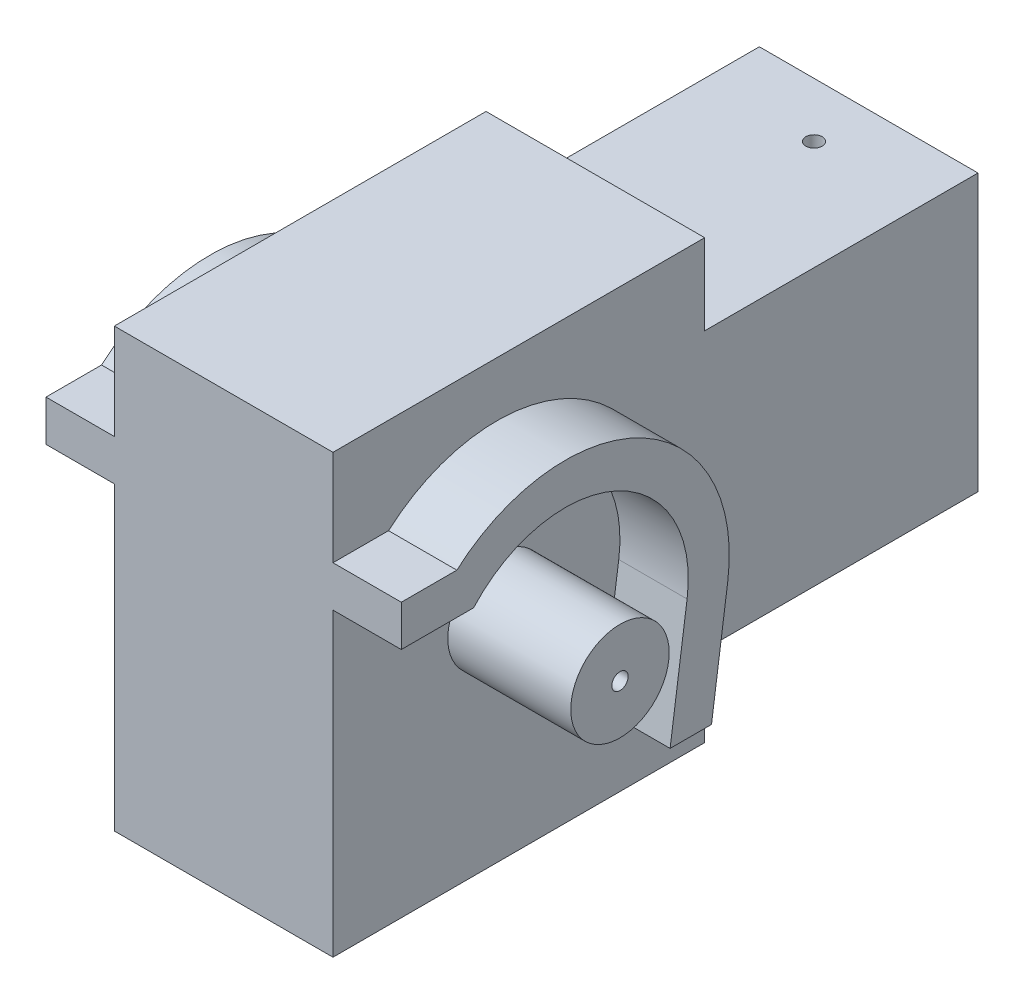
ISO-10303-21;
HEADER;
FILE_DESCRIPTION(('STEP AP214'),'2;1');
FILE_NAME('part.step','',(''),(''),'','','');
FILE_SCHEMA(('AUTOMOTIVE_DESIGN { 1 0 10303 214 1 1 1 1 }'));
ENDSEC;
DATA;
#1=APPLICATION_CONTEXT('core data for automotive mechanical design processes');
#2=APPLICATION_PROTOCOL_DEFINITION('international standard','automotive_design',2000,#1);
#3=PRODUCT_CONTEXT('',#1,'mechanical');
#4=PRODUCT('Part','Part','',(#3));
#5=PRODUCT_RELATED_PRODUCT_CATEGORY('part','',(#4));
#6=PRODUCT_DEFINITION_FORMATION('','',#4);
#7=PRODUCT_DEFINITION_CONTEXT('part definition',#1,'design');
#8=PRODUCT_DEFINITION('design','',#6,#7);
#9=PRODUCT_DEFINITION_SHAPE('','',#8);
#10=(LENGTH_UNIT() NAMED_UNIT(*) SI_UNIT(.MILLI.,.METRE.));
#11=(NAMED_UNIT(*) PLANE_ANGLE_UNIT() SI_UNIT($,.RADIAN.));
#12=(NAMED_UNIT(*) SI_UNIT($,.STERADIAN.) SOLID_ANGLE_UNIT());
#13=UNCERTAINTY_MEASURE_WITH_UNIT(LENGTH_MEASURE(1.E-05),#10,'distance_accuracy_value','');
#14=(GEOMETRIC_REPRESENTATION_CONTEXT(3) GLOBAL_UNCERTAINTY_ASSIGNED_CONTEXT((#13)) GLOBAL_UNIT_ASSIGNED_CONTEXT((#10,
#11,#12)) REPRESENTATION_CONTEXT('',''));
#15=CARTESIAN_POINT('',(0.,0.,0.));
#16=DIRECTION('',(0.,0.,1.));
#17=DIRECTION('',(1.,0.,0.));
#18=AXIS2_PLACEMENT_3D('',#15,#16,#17);
#19=CARTESIAN_POINT('',(4.,-8.,6.));
#20=DIRECTION('',(0.,1.,0.));
#21=DIRECTION('',(0.,0.,1.));
#22=AXIS2_PLACEMENT_3D('',#19,#20,#21);
#23=PLANE('',#22);
#24=DIRECTION('',(-1.,0.,0.));
#25=VECTOR('',#24,1.);
#26=CARTESIAN_POINT('',(0.,-8.,-7.6));
#27=LINE('',#26,#25);
#28=CARTESIAN_POINT('',(4.,-8.,-7.6));
#29=VERTEX_POINT('',#28);
#30=CARTESIAN_POINT('',(-4.,-8.,-7.6));
#31=VERTEX_POINT('',#30);
#32=EDGE_CURVE('E341',#29,#31,#27,.T.);
#33=ORIENTED_EDGE('',*,*,#32,.F.);
#34=DIRECTION('',(0.,0.,-1.));
#35=VECTOR('',#34,1.);
#36=CARTESIAN_POINT('',(4.,-8.,6.));
#37=LINE('',#36,#35);
#38=CARTESIAN_POINT('',(4.,-8.,6.));
#39=VERTEX_POINT('',#38);
#40=EDGE_CURVE('E436',#39,#29,#37,.T.);
#41=ORIENTED_EDGE('',*,*,#40,.F.);
#42=DIRECTION('',(-1.,0.,0.));
#43=VECTOR('',#42,1.);
#44=CARTESIAN_POINT('',(4.,-8.,6.));
#45=LINE('',#44,#43);
#46=CARTESIAN_POINT('',(-4.,-8.,6.));
#47=VERTEX_POINT('',#46);
#48=EDGE_CURVE('E450',#39,#47,#45,.T.);
#49=ORIENTED_EDGE('',*,*,#48,.T.);
#50=DIRECTION('',(0.,0.,-1.));
#51=VECTOR('',#50,1.);
#52=CARTESIAN_POINT('',(-4.,-8.,6.));
#53=LINE('',#52,#51);
#54=EDGE_CURVE('E284',#47,#31,#53,.T.);
#55=ORIENTED_EDGE('',*,*,#54,.T.);
#56=EDGE_LOOP('',(#33,#41,#49,#55));
#57=FACE_BOUND('',#56,.T.);
#58=ADVANCED_FACE('F39',(#57),#23,.F.);
#59=CARTESIAN_POINT('',(4.,8.,6.));
#60=DIRECTION('',(0.,0.,-1.));
#61=DIRECTION('',(-1.,0.,0.));
#62=AXIS2_PLACEMENT_3D('',#59,#60,#61);
#63=PLANE('',#62);
#64=DIRECTION('',(-1.,0.,0.));
#65=VECTOR('',#64,1.);
#66=CARTESIAN_POINT('',(4.,8.,6.));
#67=LINE('',#66,#65);
#68=CARTESIAN_POINT('',(4.,8.,6.));
#69=VERTEX_POINT('',#68);
#70=CARTESIAN_POINT('',(-4.,8.,6.));
#71=VERTEX_POINT('',#70);
#72=EDGE_CURVE('E447',#69,#71,#67,.T.);
#73=ORIENTED_EDGE('',*,*,#72,.T.);
#74=DIRECTION('',(0.,-1.,0.));
#75=VECTOR('',#74,1.);
#76=CARTESIAN_POINT('',(-4.,8.,6.));
#77=LINE('',#76,#75);
#78=CARTESIAN_POINT('',(-4.,4.5,6.));
#79=VERTEX_POINT('',#78);
#80=EDGE_CURVE('E280',#71,#79,#77,.T.);
#81=ORIENTED_EDGE('',*,*,#80,.T.);
#82=DIRECTION('',(1.,0.,0.));
#83=VECTOR('',#82,1.);
#84=CARTESIAN_POINT('',(-6.5,4.5,6.));
#85=LINE('',#84,#83);
#86=CARTESIAN_POINT('',(-6.5,4.5,6.));
#87=VERTEX_POINT('',#86);
#88=EDGE_CURVE('E259',#87,#79,#85,.T.);
#89=ORIENTED_EDGE('',*,*,#88,.F.);
#90=DIRECTION('',(0.,1.,0.));
#91=VECTOR('',#90,1.);
#92=CARTESIAN_POINT('',(-6.5,0.,6.));
#93=LINE('',#92,#91);
#94=CARTESIAN_POINT('',(-6.5,3.,6.));
#95=VERTEX_POINT('',#94);
#96=EDGE_CURVE('E241',#95,#87,#93,.T.);
#97=ORIENTED_EDGE('',*,*,#96,.F.);
#98=DIRECTION('',(1.,0.,0.));
#99=VECTOR('',#98,1.);
#100=CARTESIAN_POINT('',(-6.5,3.,6.));
#101=LINE('',#100,#99);
#102=CARTESIAN_POINT('',(-4.,3.,6.));
#103=VERTEX_POINT('',#102);
#104=EDGE_CURVE('E242',#95,#103,#101,.T.);
#105=ORIENTED_EDGE('',*,*,#104,.T.);
#106=EDGE_CURVE('E276',#103,#47,#77,.T.);
#107=ORIENTED_EDGE('',*,*,#106,.T.);
#108=ORIENTED_EDGE('',*,*,#48,.F.);
#109=DIRECTION('',(0.,-1.,0.));
#110=VECTOR('',#109,1.);
#111=CARTESIAN_POINT('',(4.,8.,6.));
#112=LINE('',#111,#110);
#113=CARTESIAN_POINT('',(4.,3.,6.));
#114=VERTEX_POINT('',#113);
#115=EDGE_CURVE('E429',#114,#39,#112,.T.);
#116=ORIENTED_EDGE('',*,*,#115,.F.);
#117=DIRECTION('',(-1.,0.,0.));
#118=VECTOR('',#117,1.);
#119=CARTESIAN_POINT('',(6.5,3.,6.));
#120=LINE('',#119,#118);
#121=CARTESIAN_POINT('',(6.5,3.,6.));
#122=VERTEX_POINT('',#121);
#123=EDGE_CURVE('E394',#122,#114,#120,.T.);
#124=ORIENTED_EDGE('',*,*,#123,.F.);
#125=DIRECTION('',(0.,1.,0.));
#126=VECTOR('',#125,1.);
#127=CARTESIAN_POINT('',(6.5,0.,6.));
#128=LINE('',#127,#126);
#129=CARTESIAN_POINT('',(6.5,4.5,6.));
#130=VERTEX_POINT('',#129);
#131=EDGE_CURVE('E349',#122,#130,#128,.T.);
#132=ORIENTED_EDGE('',*,*,#131,.T.);
#133=DIRECTION('',(-1.,0.,0.));
#134=VECTOR('',#133,1.);
#135=CARTESIAN_POINT('',(6.5,4.5,6.));
#136=LINE('',#135,#134);
#137=CARTESIAN_POINT('',(4.,4.5,6.));
#138=VERTEX_POINT('',#137);
#139=EDGE_CURVE('E375',#130,#138,#136,.T.);
#140=ORIENTED_EDGE('',*,*,#139,.T.);
#141=EDGE_CURVE('E433',#69,#138,#112,.T.);
#142=ORIENTED_EDGE('',*,*,#141,.F.);
#143=EDGE_LOOP('',(#73,#81,#89,#97,#105,#107,#108,#116,#124,#132,#140,#142));
#144=FACE_BOUND('',#143,.T.);
#145=ADVANCED_FACE('F41',(#144),#63,.F.);
#146=CARTESIAN_POINT('',(4.,8.,-17.6));
#147=DIRECTION('',(0.,0.,-1.));
#148=DIRECTION('',(-1.,0.,0.));
#149=AXIS2_PLACEMENT_3D('',#146,#147,#148);
#150=PLANE('',#149);
#151=DIRECTION('',(-1.,0.,0.));
#152=VECTOR('',#151,1.);
#153=CARTESIAN_POINT('',(0.,5.05,-17.6));
#154=LINE('',#153,#152);
#155=CARTESIAN_POINT('',(4.,5.05,-17.6));
#156=VERTEX_POINT('',#155);
#157=CARTESIAN_POINT('',(-4.,5.05,-17.6));
#158=VERTEX_POINT('',#157);
#159=EDGE_CURVE('E320',#156,#158,#154,.T.);
#160=ORIENTED_EDGE('',*,*,#159,.F.);
#161=DIRECTION('',(0.,-1.,0.));
#162=VECTOR('',#161,1.);
#163=CARTESIAN_POINT('',(4.,8.,-17.6));
#164=LINE('',#163,#162);
#165=CARTESIAN_POINT('',(4.,-5.05,-17.6));
#166=VERTEX_POINT('',#165);
#167=EDGE_CURVE('E439',#156,#166,#164,.T.);
#168=ORIENTED_EDGE('',*,*,#167,.T.);
#169=DIRECTION('',(1.,0.,0.));
#170=VECTOR('',#169,1.);
#171=CARTESIAN_POINT('',(0.,-5.05,-17.6));
#172=LINE('',#171,#170);
#173=CARTESIAN_POINT('',(-4.,-5.05,-17.6));
#174=VERTEX_POINT('',#173);
#175=EDGE_CURVE('E312',#174,#166,#172,.T.);
#176=ORIENTED_EDGE('',*,*,#175,.F.);
#177=DIRECTION('',(0.,-1.,0.));
#178=VECTOR('',#177,1.);
#179=CARTESIAN_POINT('',(-4.,8.,-17.6));
#180=LINE('',#179,#178);
#181=EDGE_CURVE('E288',#158,#174,#180,.T.);
#182=ORIENTED_EDGE('',*,*,#181,.F.);
#183=EDGE_LOOP('',(#160,#168,#176,#182));
#184=FACE_BOUND('',#183,.T.);
#185=ADVANCED_FACE('F482',(#184),#150,.T.);
#186=CARTESIAN_POINT('',(4.,8.,6.));
#187=DIRECTION('',(0.,1.,0.));
#188=DIRECTION('',(0.,0.,1.));
#189=AXIS2_PLACEMENT_3D('',#186,#187,#188);
#190=PLANE('',#189);
#191=DIRECTION('',(1.,0.,0.));
#192=VECTOR('',#191,1.);
#193=CARTESIAN_POINT('',(0.,8.,-7.6));
#194=LINE('',#193,#192);
#195=CARTESIAN_POINT('',(-4.,8.,-7.6));
#196=VERTEX_POINT('',#195);
#197=CARTESIAN_POINT('',(4.,8.,-7.6));
#198=VERTEX_POINT('',#197);
#199=EDGE_CURVE('E316',#196,#198,#194,.T.);
#200=ORIENTED_EDGE('',*,*,#199,.F.);
#201=DIRECTION('',(0.,0.,-1.));
#202=VECTOR('',#201,1.);
#203=CARTESIAN_POINT('',(-4.,8.,6.));
#204=LINE('',#203,#202);
#205=EDGE_CURVE('E292',#71,#196,#204,.T.);
#206=ORIENTED_EDGE('',*,*,#205,.F.);
#207=ORIENTED_EDGE('',*,*,#72,.F.);
#208=DIRECTION('',(0.,0.,-1.));
#209=VECTOR('',#208,1.);
#210=CARTESIAN_POINT('',(4.,8.,6.));
#211=LINE('',#210,#209);
#212=EDGE_CURVE('E443',#69,#198,#211,.T.);
#213=ORIENTED_EDGE('',*,*,#212,.T.);
#214=EDGE_LOOP('',(#200,#206,#207,#213));
#215=FACE_BOUND('',#214,.T.);
#216=ADVANCED_FACE('F488',(#215),#190,.T.);
#217=CARTESIAN_POINT('',(4.,0.,0.));
#218=DIRECTION('',(1.,0.,0.));
#219=DIRECTION('',(0.,0.,-1.));
#220=AXIS2_PLACEMENT_3D('',#217,#218,#219);
#221=PLANE('',#220);
#222=DIRECTION('',(0.,-0.990268068741571,0.139173100960062));
#223=VECTOR('',#222,1.);
#224=CARTESIAN_POINT('',(4.,-0.835038605760369,-5.94160841244942));
#225=LINE('',#224,#223);
#226=CARTESIAN_POINT('',(4.,-0.835038605760374,-5.94160841244943));
#227=VERTEX_POINT('',#226);
#228=CARTESIAN_POINT('',(4.,-5.05,-5.34923421986465));
#229=VERTEX_POINT('',#228);
#230=EDGE_CURVE('E382',#227,#229,#225,.T.);
#231=ORIENTED_EDGE('',*,*,#230,.T.);
#232=DIRECTION('',(0.,0.,-1.));
#233=VECTOR('',#232,1.);
#234=CARTESIAN_POINT('',(4.,-5.05,-7.6));
#235=LINE('',#234,#233);
#236=CARTESIAN_POINT('',(4.,-5.05,-3.83449286108672));
#237=VERTEX_POINT('',#236);
#238=EDGE_CURVE('E299',#237,#229,#235,.T.);
#239=ORIENTED_EDGE('',*,*,#238,.F.);
#240=DIRECTION('',(0.,0.990268068741571,-0.139173100960062));
#241=VECTOR('',#240,1.);
#242=CARTESIAN_POINT('',(4.,-0.626278954320277,-4.45620630933707));
#243=LINE('',#242,#241);
#244=CARTESIAN_POINT('',(4.,-0.626278954320281,-4.45620630933707));
#245=VERTEX_POINT('',#244);
#246=EDGE_CURVE('E386',#237,#245,#243,.T.);
#247=ORIENTED_EDGE('',*,*,#246,.T.);
#248=CARTESIAN_POINT('',(4.,0.,0.));
#249=DIRECTION('',(1.,0.,0.));
#250=DIRECTION('',(0.,0.,-1.));
#251=AXIS2_PLACEMENT_3D('',#248,#249,#250);
#252=CIRCLE('',#251,4.5);
#253=CARTESIAN_POINT('',(4.,3.,3.35410196624968));
#254=VERTEX_POINT('',#253);
#255=EDGE_CURVE('E62',#245,#254,#252,.T.);
#256=ORIENTED_EDGE('',*,*,#255,.T.);
#257=DIRECTION('',(0.,0.,-1.));
#258=VECTOR('',#257,1.);
#259=CARTESIAN_POINT('',(4.,3.,0.));
#260=LINE('',#259,#258);
#261=EDGE_CURVE('E354',#114,#254,#260,.T.);
#262=ORIENTED_EDGE('',*,*,#261,.F.);
#263=ORIENTED_EDGE('',*,*,#115,.T.);
#264=ORIENTED_EDGE('',*,*,#40,.T.);
#265=DIRECTION('',(0.,-1.,0.));
#266=VECTOR('',#265,1.);
#267=CARTESIAN_POINT('',(4.,-8.,-7.6));
#268=LINE('',#267,#266);
#269=CARTESIAN_POINT('',(4.,-5.05,-7.6));
#270=VERTEX_POINT('',#269);
#271=EDGE_CURVE('E337',#270,#29,#268,.T.);
#272=ORIENTED_EDGE('',*,*,#271,.F.);
#273=DIRECTION('',(0.,0.,-1.));
#274=VECTOR('',#273,1.);
#275=CARTESIAN_POINT('',(4.,-5.05,-7.6));
#276=LINE('',#275,#274);
#277=EDGE_CURVE('E329',#270,#166,#276,.T.);
#278=ORIENTED_EDGE('',*,*,#277,.T.);
#279=ORIENTED_EDGE('',*,*,#167,.F.);
#280=DIRECTION('',(0.,0.,-1.));
#281=VECTOR('',#280,1.);
#282=CARTESIAN_POINT('',(4.,5.05,-7.6));
#283=LINE('',#282,#281);
#284=CARTESIAN_POINT('',(4.,5.05,-7.6));
#285=VERTEX_POINT('',#284);
#286=EDGE_CURVE('E326',#285,#156,#283,.T.);
#287=ORIENTED_EDGE('',*,*,#286,.F.);
#288=DIRECTION('',(0.,-1.,0.));
#289=VECTOR('',#288,1.);
#290=CARTESIAN_POINT('',(4.,8.,-7.6));
#291=LINE('',#290,#289);
#292=EDGE_CURVE('E319',#198,#285,#291,.T.);
#293=ORIENTED_EDGE('',*,*,#292,.F.);
#294=ORIENTED_EDGE('',*,*,#212,.F.);
#295=ORIENTED_EDGE('',*,*,#141,.T.);
#296=DIRECTION('',(0.,0.,-1.));
#297=VECTOR('',#296,1.);
#298=CARTESIAN_POINT('',(4.,4.5,0.));
#299=LINE('',#298,#297);
#300=CARTESIAN_POINT('',(4.,4.5,3.96862696659688));
#301=VERTEX_POINT('',#300);
#302=EDGE_CURVE('E332',#138,#301,#299,.T.);
#303=ORIENTED_EDGE('',*,*,#302,.T.);
#304=CARTESIAN_POINT('',(4.,0.,0.));
#305=DIRECTION('',(1.,0.,0.));
#306=DIRECTION('',(0.,0.,-1.));
#307=AXIS2_PLACEMENT_3D('',#304,#305,#306);
#308=CIRCLE('',#307,6.);
#309=EDGE_CURVE('E378',#227,#301,#308,.T.);
#310=ORIENTED_EDGE('',*,*,#309,.F.);
#311=EDGE_LOOP('',(#231,#239,#247,#256,#262,#263,#264,#272,#278,#279,#287,#293,#294,#295,#303,#310));
#312=FACE_BOUND('',#311,.T.);
#313=CARTESIAN_POINT('',(4.,0.,0.));
#314=DIRECTION('',(1.,0.,0.));
#315=DIRECTION('',(0.,0.,-1.));
#316=AXIS2_PLACEMENT_3D('',#313,#314,#315);
#317=CIRCLE('',#316,1.8);
#318=CARTESIAN_POINT('',(4.,0.,-1.8));
#319=VERTEX_POINT('',#318);
#320=EDGE_CURVE('E421',#319,#319,#317,.T.);
#321=ORIENTED_EDGE('',*,*,#320,.F.);
#322=EDGE_LOOP('',(#321));
#323=FACE_BOUND('',#322,.T.);
#324=ADVANCED_FACE('F492',(#312,#323),#221,.T.);
#325=CARTESIAN_POINT('',(8.5,0.,0.));
#326=DIRECTION('',(-1.,0.,0.));
#327=DIRECTION('',(0.,0.,1.));
#328=AXIS2_PLACEMENT_3D('',#325,#326,#327);
#329=CYLINDRICAL_SURFACE('',#328,1.8);
#330=CARTESIAN_POINT('',(8.5,0.,0.));
#331=DIRECTION('',(1.,0.,0.));
#332=DIRECTION('',(0.,0.,-1.));
#333=AXIS2_PLACEMENT_3D('',#330,#331,#332);
#334=CIRCLE('',#333,1.8);
#335=CARTESIAN_POINT('',(8.5,0.,-1.8));
#336=VERTEX_POINT('',#335);
#337=EDGE_CURVE('E425',#336,#336,#334,.T.);
#338=ORIENTED_EDGE('',*,*,#337,.F.);
#339=EDGE_LOOP('',(#338));
#340=FACE_BOUND('',#339,.T.);
#341=ORIENTED_EDGE('',*,*,#320,.T.);
#342=EDGE_LOOP('',(#341));
#343=FACE_BOUND('',#342,.T.);
#344=ADVANCED_FACE('F496',(#340,#343),#329,.T.);
#345=CARTESIAN_POINT('',(8.5,0.,0.));
#346=DIRECTION('',(1.,0.,0.));
#347=DIRECTION('',(0.,0.,-1.));
#348=AXIS2_PLACEMENT_3D('',#345,#346,#347);
#349=PLANE('',#348);
#350=CARTESIAN_POINT('',(8.5,0.,0.));
#351=DIRECTION('',(1.,0.,0.));
#352=DIRECTION('',(0.,0.,-1.));
#353=AXIS2_PLACEMENT_3D('',#350,#351,#352);
#354=CIRCLE('',#353,0.3);
#355=CARTESIAN_POINT('',(8.5,0.,-0.3));
#356=VERTEX_POINT('',#355);
#357=EDGE_CURVE('E398',#356,#356,#354,.T.);
#358=ORIENTED_EDGE('',*,*,#357,.F.);
#359=EDGE_LOOP('',(#358));
#360=FACE_BOUND('',#359,.T.);
#361=ORIENTED_EDGE('',*,*,#337,.T.);
#362=EDGE_LOOP('',(#361));
#363=FACE_BOUND('',#362,.T.);
#364=ADVANCED_FACE('F499',(#360,#363),#349,.T.);
#365=CARTESIAN_POINT('',(7.5,0.,0.));
#366=DIRECTION('',(1.,0.,0.));
#367=DIRECTION('',(0.,0.,-1.));
#368=AXIS2_PLACEMENT_3D('',#365,#366,#367);
#369=CYLINDRICAL_SURFACE('',#368,0.3);
#370=CARTESIAN_POINT('',(7.5,0.,0.));
#371=DIRECTION('',(1.,0.,0.));
#372=DIRECTION('',(0.,0.,-1.));
#373=AXIS2_PLACEMENT_3D('',#370,#371,#372);
#374=CIRCLE('',#373,0.3);
#375=CARTESIAN_POINT('',(7.5,0.,-0.3));
#376=VERTEX_POINT('',#375);
#377=EDGE_CURVE('E417',#376,#376,#374,.T.);
#378=ORIENTED_EDGE('',*,*,#377,.F.);
#379=EDGE_LOOP('',(#378));
#380=FACE_BOUND('',#379,.T.);
#381=ORIENTED_EDGE('',*,*,#357,.T.);
#382=EDGE_LOOP('',(#381));
#383=FACE_BOUND('',#382,.T.);
#384=ADVANCED_FACE('F503',(#380,#383),#369,.F.);
#385=CARTESIAN_POINT('',(7.5,0.,0.));
#386=DIRECTION('',(1.,0.,0.));
#387=DIRECTION('',(0.,0.,-1.));
#388=AXIS2_PLACEMENT_3D('',#385,#386,#387);
#389=PLANE('',#388);
#390=ORIENTED_EDGE('',*,*,#377,.T.);
#391=EDGE_LOOP('',(#390));
#392=FACE_BOUND('',#391,.T.);
#393=ADVANCED_FACE('F507',(#392),#389,.T.);
#394=CARTESIAN_POINT('',(6.5,3.,0.));
#395=DIRECTION('',(0.,1.,0.));
#396=DIRECTION('',(0.,0.,1.));
#397=AXIS2_PLACEMENT_3D('',#394,#395,#396);
#398=PLANE('',#397);
#399=ORIENTED_EDGE('',*,*,#261,.T.);
#400=DIRECTION('',(-1.,0.,0.));
#401=VECTOR('',#400,1.);
#402=CARTESIAN_POINT('',(6.5,3.,3.35410196624968));
#403=LINE('',#402,#401);
#404=CARTESIAN_POINT('',(6.5,3.,3.35410196624968));
#405=VERTEX_POINT('',#404);
#406=EDGE_CURVE('E399',#405,#254,#403,.T.);
#407=ORIENTED_EDGE('',*,*,#406,.F.);
#408=DIRECTION('',(0.,0.,-1.));
#409=VECTOR('',#408,1.);
#410=CARTESIAN_POINT('',(6.5,3.,0.));
#411=LINE('',#410,#409);
#412=EDGE_CURVE('E372',#122,#405,#411,.T.);
#413=ORIENTED_EDGE('',*,*,#412,.F.);
#414=ORIENTED_EDGE('',*,*,#123,.T.);
#415=EDGE_LOOP('',(#399,#407,#413,#414));
#416=FACE_BOUND('',#415,.T.);
#417=ADVANCED_FACE('F511',(#416),#398,.F.);
#418=CARTESIAN_POINT('',(6.5,0.,0.));
#419=DIRECTION('',(-1.,0.,0.));
#420=DIRECTION('',(0.,0.,1.));
#421=AXIS2_PLACEMENT_3D('',#418,#419,#420);
#422=CYLINDRICAL_SURFACE('',#421,4.5);
#423=ORIENTED_EDGE('',*,*,#255,.F.);
#424=DIRECTION('',(-1.,0.,0.));
#425=VECTOR('',#424,1.);
#426=CARTESIAN_POINT('',(6.5,-0.626278954320281,-4.45620630933707));
#427=LINE('',#426,#425);
#428=CARTESIAN_POINT('',(6.5,-0.626278954320281,-4.45620630933707));
#429=VERTEX_POINT('',#428);
#430=EDGE_CURVE('E402',#429,#245,#427,.T.);
#431=ORIENTED_EDGE('',*,*,#430,.F.);
#432=CARTESIAN_POINT('',(6.5,0.,0.));
#433=DIRECTION('',(1.,0.,0.));
#434=DIRECTION('',(0.,0.,-1.));
#435=AXIS2_PLACEMENT_3D('',#432,#433,#434);
#436=CIRCLE('',#435,4.5);
#437=EDGE_CURVE('E368',#429,#405,#436,.T.);
#438=ORIENTED_EDGE('',*,*,#437,.T.);
#439=ORIENTED_EDGE('',*,*,#406,.T.);
#440=EDGE_LOOP('',(#423,#431,#438,#439));
#441=FACE_BOUND('',#440,.T.);
#442=ADVANCED_FACE('F529',(#441),#422,.F.);
#443=CARTESIAN_POINT('',(6.5,-0.626278954320277,-4.45620630933707));
#444=DIRECTION('',(0.,0.139173100960062,0.990268068741571));
#445=DIRECTION('',(0.,-0.990268068741571,0.139173100960062));
#446=AXIS2_PLACEMENT_3D('',#443,#444,#445);
#447=PLANE('',#446);
#448=DIRECTION('',(-1.,0.,0.));
#449=VECTOR('',#448,1.);
#450=CARTESIAN_POINT('',(6.5,-5.05,-3.83449286108672));
#451=LINE('',#450,#449);
#452=CARTESIAN_POINT('',(6.5,-5.05,-3.83449286108672));
#453=VERTEX_POINT('',#452);
#454=EDGE_CURVE('E304',#453,#237,#451,.T.);
#455=ORIENTED_EDGE('',*,*,#454,.F.);
#456=DIRECTION('',(0.,0.990268068741571,-0.139173100960062));
#457=VECTOR('',#456,1.);
#458=CARTESIAN_POINT('',(6.5,-0.626278954320277,-4.45620630933707));
#459=LINE('',#458,#457);
#460=EDGE_CURVE('E365',#453,#429,#459,.T.);
#461=ORIENTED_EDGE('',*,*,#460,.T.);
#462=ORIENTED_EDGE('',*,*,#430,.T.);
#463=ORIENTED_EDGE('',*,*,#246,.F.);
#464=EDGE_LOOP('',(#455,#461,#462,#463));
#465=FACE_BOUND('',#464,.T.);
#466=ADVANCED_FACE('F525',(#465),#447,.T.);
#467=CARTESIAN_POINT('',(6.5,-0.835038605760369,-5.94160841244942));
#468=DIRECTION('',(0.,-0.139173100960062,-0.990268068741571));
#469=DIRECTION('',(0.,0.990268068741571,-0.139173100960062));
#470=AXIS2_PLACEMENT_3D('',#467,#468,#469);
#471=PLANE('',#470);
#472=DIRECTION('',(1.,0.,0.));
#473=VECTOR('',#472,1.);
#474=CARTESIAN_POINT('',(6.5,-5.05,-5.34923421986465));
#475=LINE('',#474,#473);
#476=CARTESIAN_POINT('',(6.5,-5.05,-5.34923421986465));
#477=VERTEX_POINT('',#476);
#478=EDGE_CURVE('E54',#229,#477,#475,.T.);
#479=ORIENTED_EDGE('',*,*,#478,.F.);
#480=ORIENTED_EDGE('',*,*,#230,.F.);
#481=DIRECTION('',(-1.,0.,0.));
#482=VECTOR('',#481,1.);
#483=CARTESIAN_POINT('',(6.5,-0.835038605760374,-5.94160841244942));
#484=LINE('',#483,#482);
#485=CARTESIAN_POINT('',(6.5,-0.835038605760374,-5.94160841244942));
#486=VERTEX_POINT('',#485);
#487=EDGE_CURVE('E406',#486,#227,#484,.T.);
#488=ORIENTED_EDGE('',*,*,#487,.F.);
#489=DIRECTION('',(0.,-0.990268068741571,0.139173100960062));
#490=VECTOR('',#489,1.);
#491=CARTESIAN_POINT('',(6.5,-0.835038605760369,-5.94160841244942));
#492=LINE('',#491,#490);
#493=EDGE_CURVE('E361',#486,#477,#492,.T.);
#494=ORIENTED_EDGE('',*,*,#493,.T.);
#495=EDGE_LOOP('',(#479,#480,#488,#494));
#496=FACE_BOUND('',#495,.T.);
#497=ADVANCED_FACE('F521',(#496),#471,.T.);
#498=CARTESIAN_POINT('',(6.5,0.,0.));
#499=DIRECTION('',(-1.,0.,0.));
#500=DIRECTION('',(0.,0.,1.));
#501=AXIS2_PLACEMENT_3D('',#498,#499,#500);
#502=CYLINDRICAL_SURFACE('',#501,6.);
#503=ORIENTED_EDGE('',*,*,#309,.T.);
#504=DIRECTION('',(-1.,0.,0.));
#505=VECTOR('',#504,1.);
#506=CARTESIAN_POINT('',(6.5,4.5,3.96862696659688));
#507=LINE('',#506,#505);
#508=CARTESIAN_POINT('',(6.5,4.5,3.96862696659688));
#509=VERTEX_POINT('',#508);
#510=EDGE_CURVE('E410',#509,#301,#507,.T.);
#511=ORIENTED_EDGE('',*,*,#510,.F.);
#512=CARTESIAN_POINT('',(6.5,0.,0.));
#513=DIRECTION('',(1.,0.,0.));
#514=DIRECTION('',(0.,0.,-1.));
#515=AXIS2_PLACEMENT_3D('',#512,#513,#514);
#516=CIRCLE('',#515,6.);
#517=EDGE_CURVE('E358',#486,#509,#516,.T.);
#518=ORIENTED_EDGE('',*,*,#517,.F.);
#519=ORIENTED_EDGE('',*,*,#487,.T.);
#520=EDGE_LOOP('',(#503,#511,#518,#519));
#521=FACE_BOUND('',#520,.T.);
#522=ADVANCED_FACE('F517',(#521),#502,.T.);
#523=CARTESIAN_POINT('',(6.5,4.5,0.));
#524=DIRECTION('',(0.,1.,0.));
#525=DIRECTION('',(0.,0.,1.));
#526=AXIS2_PLACEMENT_3D('',#523,#524,#525);
#527=PLANE('',#526);
#528=ORIENTED_EDGE('',*,*,#302,.F.);
#529=ORIENTED_EDGE('',*,*,#139,.F.);
#530=DIRECTION('',(0.,0.,-1.));
#531=VECTOR('',#530,1.);
#532=CARTESIAN_POINT('',(6.5,4.5,0.));
#533=LINE('',#532,#531);
#534=EDGE_CURVE('E353',#130,#509,#533,.T.);
#535=ORIENTED_EDGE('',*,*,#534,.T.);
#536=ORIENTED_EDGE('',*,*,#510,.T.);
#537=EDGE_LOOP('',(#528,#529,#535,#536));
#538=FACE_BOUND('',#537,.T.);
#539=ADVANCED_FACE('F513',(#538),#527,.T.);
#540=CARTESIAN_POINT('',(6.5,0.,0.));
#541=DIRECTION('',(1.,0.,0.));
#542=DIRECTION('',(0.,0.,-1.));
#543=AXIS2_PLACEMENT_3D('',#540,#541,#542);
#544=PLANE('',#543);
#545=DIRECTION('',(0.,0.,1.));
#546=VECTOR('',#545,1.);
#547=CARTESIAN_POINT('',(6.5,-5.05,0.));
#548=LINE('',#547,#546);
#549=EDGE_CURVE('E11',#477,#453,#548,.T.);
#550=ORIENTED_EDGE('',*,*,#549,.F.);
#551=ORIENTED_EDGE('',*,*,#493,.F.);
#552=ORIENTED_EDGE('',*,*,#517,.T.);
#553=ORIENTED_EDGE('',*,*,#534,.F.);
#554=ORIENTED_EDGE('',*,*,#131,.F.);
#555=ORIENTED_EDGE('',*,*,#412,.T.);
#556=ORIENTED_EDGE('',*,*,#437,.F.);
#557=ORIENTED_EDGE('',*,*,#460,.F.);
#558=EDGE_LOOP('',(#550,#551,#552,#553,#554,#555,#556,#557));
#559=FACE_BOUND('',#558,.T.);
#560=ADVANCED_FACE('F516',(#559),#544,.T.);
#561=CARTESIAN_POINT('',(0.,-5.05,-7.6));
#562=DIRECTION('',(0.,1.,0.));
#563=DIRECTION('',(0.,0.,1.));
#564=AXIS2_PLACEMENT_3D('',#561,#562,#563);
#565=PLANE('',#564);
#566=CARTESIAN_POINT('',(0.,-5.05,-9.6));
#567=DIRECTION('',(0.,-1.,0.));
#568=DIRECTION('',(0.,0.,-1.));
#569=AXIS2_PLACEMENT_3D('',#566,#567,#568);
#570=CIRCLE('',#569,0.3);
#571=CARTESIAN_POINT('',(0.,-5.05,-9.9));
#572=VERTEX_POINT('',#571);
#573=EDGE_CURVE('E308',#572,#572,#570,.T.);
#574=ORIENTED_EDGE('',*,*,#573,.F.);
#575=EDGE_LOOP('',(#574));
#576=FACE_BOUND('',#575,.T.);
#577=CARTESIAN_POINT('',(0.,-5.05,-15.6));
#578=DIRECTION('',(0.,-1.,0.));
#579=DIRECTION('',(0.,0.,-1.));
#580=AXIS2_PLACEMENT_3D('',#577,#578,#579);
#581=CIRCLE('',#580,0.300000000000002);
#582=CARTESIAN_POINT('',(0.,-5.05,-15.9));
#583=VERTEX_POINT('',#582);
#584=EDGE_CURVE('E307',#583,#583,#581,.T.);
#585=ORIENTED_EDGE('',*,*,#584,.F.);
#586=EDGE_LOOP('',(#585));
#587=FACE_BOUND('',#586,.T.);
#588=DIRECTION('',(1.,0.,0.));
#589=VECTOR('',#588,1.);
#590=CARTESIAN_POINT('',(0.,-5.05,-7.6));
#591=LINE('',#590,#589);
#592=CARTESIAN_POINT('',(-4.,-5.05,-7.6));
#593=VERTEX_POINT('',#592);
#594=EDGE_CURVE('E333',#593,#270,#591,.T.);
#595=ORIENTED_EDGE('',*,*,#594,.F.);
#596=DIRECTION('',(0.,0.,-1.));
#597=VECTOR('',#596,1.);
#598=CARTESIAN_POINT('',(-4.,-5.05,-7.6));
#599=LINE('',#598,#597);
#600=EDGE_CURVE('E572',#593,#174,#599,.T.);
#601=ORIENTED_EDGE('',*,*,#600,.T.);
#602=ORIENTED_EDGE('',*,*,#175,.T.);
#603=ORIENTED_EDGE('',*,*,#277,.F.);
#604=EDGE_LOOP('',(#595,#601,#602,#603));
#605=FACE_BOUND('',#604,.T.);
#606=ADVANCED_FACE('F539',(#576,#587,#605),#565,.F.);
#607=CARTESIAN_POINT('',(0.,0.,-7.6));
#608=DIRECTION('',(0.,0.,-1.));
#609=DIRECTION('',(-1.,0.,0.));
#610=AXIS2_PLACEMENT_3D('',#607,#608,#609);
#611=PLANE('',#610);
#612=ORIENTED_EDGE('',*,*,#32,.T.);
#613=DIRECTION('',(0.,-1.,0.));
#614=VECTOR('',#613,1.);
#615=CARTESIAN_POINT('',(-4.,-8.,-7.6));
#616=LINE('',#615,#614);
#617=EDGE_CURVE('E211',#593,#31,#616,.T.);
#618=ORIENTED_EDGE('',*,*,#617,.F.);
#619=ORIENTED_EDGE('',*,*,#594,.T.);
#620=ORIENTED_EDGE('',*,*,#271,.T.);
#621=EDGE_LOOP('',(#612,#618,#619,#620));
#622=FACE_BOUND('',#621,.T.);
#623=ADVANCED_FACE('F543',(#622),#611,.T.);
#624=CARTESIAN_POINT('',(0.,5.05,-7.6));
#625=DIRECTION('',(0.,-1.,0.));
#626=DIRECTION('',(0.,0.,-1.));
#627=AXIS2_PLACEMENT_3D('',#624,#625,#626);
#628=PLANE('',#627);
#629=CARTESIAN_POINT('',(0.,5.05,-9.6));
#630=DIRECTION('',(0.,-1.,0.));
#631=DIRECTION('',(0.,0.,-1.));
#632=AXIS2_PLACEMENT_3D('',#629,#630,#631);
#633=CIRCLE('',#632,0.3);
#634=CARTESIAN_POINT('',(0.,5.05,-9.9));
#635=VERTEX_POINT('',#634);
#636=EDGE_CURVE('E48',#635,#635,#633,.T.);
#637=ORIENTED_EDGE('',*,*,#636,.T.);
#638=EDGE_LOOP('',(#637));
#639=FACE_BOUND('',#638,.T.);
#640=CARTESIAN_POINT('',(0.,5.05,-15.6));
#641=DIRECTION('',(0.,-1.,0.));
#642=DIRECTION('',(0.,0.,-1.));
#643=AXIS2_PLACEMENT_3D('',#640,#641,#642);
#644=CIRCLE('',#643,0.300000000000002);
#645=CARTESIAN_POINT('',(0.,5.05,-15.9));
#646=VERTEX_POINT('',#645);
#647=EDGE_CURVE('E453',#646,#646,#644,.T.);
#648=ORIENTED_EDGE('',*,*,#647,.T.);
#649=EDGE_LOOP('',(#648));
#650=FACE_BOUND('',#649,.T.);
#651=DIRECTION('',(0.,0.,-1.));
#652=VECTOR('',#651,1.);
#653=CARTESIAN_POINT('',(-4.,5.05,-7.6));
#654=LINE('',#653,#652);
#655=CARTESIAN_POINT('',(-4.,5.05,-7.6));
#656=VERTEX_POINT('',#655);
#657=EDGE_CURVE('E563',#656,#158,#654,.T.);
#658=ORIENTED_EDGE('',*,*,#657,.F.);
#659=DIRECTION('',(-1.,0.,0.));
#660=VECTOR('',#659,1.);
#661=CARTESIAN_POINT('',(0.,5.05,-7.6));
#662=LINE('',#661,#660);
#663=EDGE_CURVE('E323',#285,#656,#662,.T.);
#664=ORIENTED_EDGE('',*,*,#663,.F.);
#665=ORIENTED_EDGE('',*,*,#286,.T.);
#666=ORIENTED_EDGE('',*,*,#159,.T.);
#667=EDGE_LOOP('',(#658,#664,#665,#666));
#668=FACE_BOUND('',#667,.T.);
#669=ADVANCED_FACE('F460',(#639,#650,#668),#628,.F.);
#670=CARTESIAN_POINT('',(0.,0.,-7.6));
#671=DIRECTION('',(0.,0.,1.));
#672=DIRECTION('',(1.,0.,0.));
#673=AXIS2_PLACEMENT_3D('',#670,#671,#672);
#674=PLANE('',#673);
#675=ORIENTED_EDGE('',*,*,#663,.T.);
#676=DIRECTION('',(0.,-1.,0.));
#677=VECTOR('',#676,1.);
#678=CARTESIAN_POINT('',(-4.,8.,-7.6));
#679=LINE('',#678,#677);
#680=EDGE_CURVE('E558',#196,#656,#679,.T.);
#681=ORIENTED_EDGE('',*,*,#680,.F.);
#682=ORIENTED_EDGE('',*,*,#199,.T.);
#683=ORIENTED_EDGE('',*,*,#292,.T.);
#684=EDGE_LOOP('',(#675,#681,#682,#683));
#685=FACE_BOUND('',#684,.T.);
#686=ADVANCED_FACE('F474',(#685),#674,.F.);
#687=CARTESIAN_POINT('',(0.,8.,-15.6));
#688=DIRECTION('',(0.,-1.,0.));
#689=DIRECTION('',(0.,0.,-1.));
#690=AXIS2_PLACEMENT_3D('',#687,#688,#689);
#691=CYLINDRICAL_SURFACE('',#690,0.300000000000002);
#692=ORIENTED_EDGE('',*,*,#584,.T.);
#693=EDGE_LOOP('',(#692));
#694=FACE_BOUND('',#693,.T.);
#695=ORIENTED_EDGE('',*,*,#647,.F.);
#696=EDGE_LOOP('',(#695));
#697=FACE_BOUND('',#696,.T.);
#698=ADVANCED_FACE('F466',(#694,#697),#691,.F.);
#699=CARTESIAN_POINT('',(0.,8.,-9.6));
#700=DIRECTION('',(0.,-1.,0.));
#701=DIRECTION('',(0.,0.,-1.));
#702=AXIS2_PLACEMENT_3D('',#699,#700,#701);
#703=CYLINDRICAL_SURFACE('',#702,0.3);
#704=ORIENTED_EDGE('',*,*,#573,.T.);
#705=EDGE_LOOP('',(#704));
#706=FACE_BOUND('',#705,.T.);
#707=ORIENTED_EDGE('',*,*,#636,.F.);
#708=EDGE_LOOP('',(#707));
#709=FACE_BOUND('',#708,.T.);
#710=ADVANCED_FACE('F463',(#706,#709),#703,.F.);
#711=CARTESIAN_POINT('',(-9.91626745934412,-5.05,-7.6));
#712=DIRECTION('',(0.,1.,0.));
#713=DIRECTION('',(0.,0.,1.));
#714=AXIS2_PLACEMENT_3D('',#711,#712,#713);
#715=PLANE('',#714);
#716=ORIENTED_EDGE('',*,*,#454,.T.);
#717=ORIENTED_EDGE('',*,*,#238,.T.);
#718=ORIENTED_EDGE('',*,*,#478,.T.);
#719=ORIENTED_EDGE('',*,*,#549,.T.);
#720=EDGE_LOOP('',(#716,#717,#718,#719));
#721=FACE_BOUND('',#720,.T.);
#722=ADVANCED_FACE('F465',(#721),#715,.F.);
#723=CARTESIAN_POINT('',(-4.,0.,0.));
#724=DIRECTION('',(-1.,0.,0.));
#725=DIRECTION('',(0.,0.,-1.));
#726=AXIS2_PLACEMENT_3D('',#723,#724,#725);
#727=PLANE('',#726);
#728=DIRECTION('',(0.,-0.990268068741571,0.139173100960062));
#729=VECTOR('',#728,1.);
#730=CARTESIAN_POINT('',(-4.,-0.835038605760369,-5.94160841244942));
#731=LINE('',#730,#729);
#732=CARTESIAN_POINT('',(-4.,-0.835038605760374,-5.94160841244943));
#733=VERTEX_POINT('',#732);
#734=CARTESIAN_POINT('',(-4.,-5.05,-5.34923421986465));
#735=VERTEX_POINT('',#734);
#736=EDGE_CURVE('E229',#733,#735,#731,.T.);
#737=ORIENTED_EDGE('',*,*,#736,.F.);
#738=CARTESIAN_POINT('',(-4.,0.,0.));
#739=DIRECTION('',(1.,0.,0.));
#740=DIRECTION('',(0.,0.,-1.));
#741=AXIS2_PLACEMENT_3D('',#738,#739,#740);
#742=CIRCLE('',#741,6.);
#743=CARTESIAN_POINT('',(-4.,4.5,3.96862696659688));
#744=VERTEX_POINT('',#743);
#745=EDGE_CURVE('E235',#733,#744,#742,.T.);
#746=ORIENTED_EDGE('',*,*,#745,.T.);
#747=DIRECTION('',(0.,0.,-1.));
#748=VECTOR('',#747,1.);
#749=CARTESIAN_POINT('',(-4.,4.5,0.));
#750=LINE('',#749,#748);
#751=EDGE_CURVE('E567',#79,#744,#750,.T.);
#752=ORIENTED_EDGE('',*,*,#751,.F.);
#753=ORIENTED_EDGE('',*,*,#80,.F.);
#754=ORIENTED_EDGE('',*,*,#205,.T.);
#755=ORIENTED_EDGE('',*,*,#680,.T.);
#756=ORIENTED_EDGE('',*,*,#657,.T.);
#757=ORIENTED_EDGE('',*,*,#181,.T.);
#758=ORIENTED_EDGE('',*,*,#600,.F.);
#759=ORIENTED_EDGE('',*,*,#617,.T.);
#760=ORIENTED_EDGE('',*,*,#54,.F.);
#761=ORIENTED_EDGE('',*,*,#106,.F.);
#762=DIRECTION('',(0.,0.,-1.));
#763=VECTOR('',#762,1.);
#764=CARTESIAN_POINT('',(-4.,3.,0.));
#765=LINE('',#764,#763);
#766=CARTESIAN_POINT('',(-4.,3.,3.35410196624968));
#767=VERTEX_POINT('',#766);
#768=EDGE_CURVE('E233',#103,#767,#765,.T.);
#769=ORIENTED_EDGE('',*,*,#768,.T.);
#770=CARTESIAN_POINT('',(-4.,0.,0.));
#771=DIRECTION('',(1.,0.,0.));
#772=DIRECTION('',(0.,0.,-1.));
#773=AXIS2_PLACEMENT_3D('',#770,#771,#772);
#774=CIRCLE('',#773,4.5);
#775=CARTESIAN_POINT('',(-4.,-0.626278954320281,-4.45620630933707));
#776=VERTEX_POINT('',#775);
#777=EDGE_CURVE('E227',#776,#767,#774,.T.);
#778=ORIENTED_EDGE('',*,*,#777,.F.);
#779=DIRECTION('',(0.,0.990268068741571,-0.139173100960062));
#780=VECTOR('',#779,1.);
#781=CARTESIAN_POINT('',(-4.,-0.626278954320277,-4.45620630933707));
#782=LINE('',#781,#780);
#783=CARTESIAN_POINT('',(-4.,-5.05,-3.83449286108672));
#784=VERTEX_POINT('',#783);
#785=EDGE_CURVE('E206',#784,#776,#782,.T.);
#786=ORIENTED_EDGE('',*,*,#785,.F.);
#787=DIRECTION('',(0.,0.,-1.));
#788=VECTOR('',#787,1.);
#789=CARTESIAN_POINT('',(-4.,-5.05,-7.6));
#790=LINE('',#789,#788);
#791=EDGE_CURVE('E215',#784,#735,#790,.T.);
#792=ORIENTED_EDGE('',*,*,#791,.T.);
#793=EDGE_LOOP('',(#737,#746,#752,#753,#754,#755,#756,#757,#758,#759,#760,#761,#769,#778,#786,#792));
#794=FACE_BOUND('',#793,.T.);
#795=CARTESIAN_POINT('',(-4.,0.,0.));
#796=DIRECTION('',(1.,0.,0.));
#797=DIRECTION('',(0.,0.,-1.));
#798=AXIS2_PLACEMENT_3D('',#795,#796,#797);
#799=CIRCLE('',#798,1.8);
#800=CARTESIAN_POINT('',(-4.,0.,-1.8));
#801=VERTEX_POINT('',#800);
#802=EDGE_CURVE('E268',#801,#801,#799,.T.);
#803=ORIENTED_EDGE('',*,*,#802,.T.);
#804=EDGE_LOOP('',(#803));
#805=FACE_BOUND('',#804,.T.);
#806=ADVANCED_FACE('F223',(#794,#805),#727,.T.);
#807=CARTESIAN_POINT('',(-8.5,0.,0.));
#808=DIRECTION('',(1.,0.,0.));
#809=DIRECTION('',(0.,0.,1.));
#810=AXIS2_PLACEMENT_3D('',#807,#808,#809);
#811=CYLINDRICAL_SURFACE('',#810,1.8);
#812=CARTESIAN_POINT('',(-8.5,0.,0.));
#813=DIRECTION('',(1.,0.,0.));
#814=DIRECTION('',(0.,0.,-1.));
#815=AXIS2_PLACEMENT_3D('',#812,#813,#814);
#816=CIRCLE('',#815,1.8);
#817=CARTESIAN_POINT('',(-8.5,0.,-1.8));
#818=VERTEX_POINT('',#817);
#819=EDGE_CURVE('E272',#818,#818,#816,.T.);
#820=ORIENTED_EDGE('',*,*,#819,.T.);
#821=EDGE_LOOP('',(#820));
#822=FACE_BOUND('',#821,.T.);
#823=ORIENTED_EDGE('',*,*,#802,.F.);
#824=EDGE_LOOP('',(#823));
#825=FACE_BOUND('',#824,.T.);
#826=ADVANCED_FACE('F667',(#822,#825),#811,.T.);
#827=CARTESIAN_POINT('',(-8.5,0.,0.));
#828=DIRECTION('',(-1.,0.,0.));
#829=DIRECTION('',(0.,0.,-1.));
#830=AXIS2_PLACEMENT_3D('',#827,#828,#829);
#831=PLANE('',#830);
#832=CARTESIAN_POINT('',(-8.5,0.,0.));
#833=DIRECTION('',(1.,0.,0.));
#834=DIRECTION('',(0.,0.,-1.));
#835=AXIS2_PLACEMENT_3D('',#832,#833,#834);
#836=CIRCLE('',#835,0.3);
#837=CARTESIAN_POINT('',(-8.5,0.,-0.3));
#838=VERTEX_POINT('',#837);
#839=EDGE_CURVE('E246',#838,#838,#836,.T.);
#840=ORIENTED_EDGE('',*,*,#839,.T.);
#841=EDGE_LOOP('',(#840));
#842=FACE_BOUND('',#841,.T.);
#843=ORIENTED_EDGE('',*,*,#819,.F.);
#844=EDGE_LOOP('',(#843));
#845=FACE_BOUND('',#844,.T.);
#846=ADVANCED_FACE('F663',(#842,#845),#831,.T.);
#847=CARTESIAN_POINT('',(-7.5,0.,0.));
#848=DIRECTION('',(-1.,0.,0.));
#849=DIRECTION('',(0.,0.,-1.));
#850=AXIS2_PLACEMENT_3D('',#847,#848,#849);
#851=CYLINDRICAL_SURFACE('',#850,0.3);
#852=CARTESIAN_POINT('',(-7.5,0.,0.));
#853=DIRECTION('',(1.,0.,0.));
#854=DIRECTION('',(0.,0.,-1.));
#855=AXIS2_PLACEMENT_3D('',#852,#853,#854);
#856=CIRCLE('',#855,0.3);
#857=CARTESIAN_POINT('',(-7.5,0.,-0.3));
#858=VERTEX_POINT('',#857);
#859=EDGE_CURVE('E264',#858,#858,#856,.T.);
#860=ORIENTED_EDGE('',*,*,#859,.T.);
#861=EDGE_LOOP('',(#860));
#862=FACE_BOUND('',#861,.T.);
#863=ORIENTED_EDGE('',*,*,#839,.F.);
#864=EDGE_LOOP('',(#863));
#865=FACE_BOUND('',#864,.T.);
#866=ADVANCED_FACE('F659',(#862,#865),#851,.F.);
#867=CARTESIAN_POINT('',(-7.5,0.,0.));
#868=DIRECTION('',(-1.,0.,0.));
#869=DIRECTION('',(0.,0.,-1.));
#870=AXIS2_PLACEMENT_3D('',#867,#868,#869);
#871=PLANE('',#870);
#872=ORIENTED_EDGE('',*,*,#859,.F.);
#873=EDGE_LOOP('',(#872));
#874=FACE_BOUND('',#873,.T.);
#875=ADVANCED_FACE('F656',(#874),#871,.T.);
#876=CARTESIAN_POINT('',(-6.5,3.,0.));
#877=DIRECTION('',(0.,1.,0.));
#878=DIRECTION('',(0.,0.,1.));
#879=AXIS2_PLACEMENT_3D('',#876,#877,#878);
#880=PLANE('',#879);
#881=ORIENTED_EDGE('',*,*,#768,.F.);
#882=ORIENTED_EDGE('',*,*,#104,.F.);
#883=DIRECTION('',(0.,0.,-1.));
#884=VECTOR('',#883,1.);
#885=CARTESIAN_POINT('',(-6.5,3.,0.));
#886=LINE('',#885,#884);
#887=CARTESIAN_POINT('',(-6.5,3.,3.35410196624968));
#888=VERTEX_POINT('',#887);
#889=EDGE_CURVE('E263',#95,#888,#886,.T.);
#890=ORIENTED_EDGE('',*,*,#889,.T.);
#891=DIRECTION('',(1.,0.,0.));
#892=VECTOR('',#891,1.);
#893=CARTESIAN_POINT('',(-6.5,3.,3.35410196624968));
#894=LINE('',#893,#892);
#895=EDGE_CURVE('E247',#888,#767,#894,.T.);
#896=ORIENTED_EDGE('',*,*,#895,.T.);
#897=EDGE_LOOP('',(#881,#882,#890,#896));
#898=FACE_BOUND('',#897,.T.);
#899=ADVANCED_FACE('F634',(#898),#880,.F.);
#900=CARTESIAN_POINT('',(-6.5,0.,0.));
#901=DIRECTION('',(1.,0.,0.));
#902=DIRECTION('',(0.,0.,1.));
#903=AXIS2_PLACEMENT_3D('',#900,#901,#902);
#904=CYLINDRICAL_SURFACE('',#903,4.5);
#905=ORIENTED_EDGE('',*,*,#777,.T.);
#906=ORIENTED_EDGE('',*,*,#895,.F.);
#907=CARTESIAN_POINT('',(-6.5,0.,0.));
#908=DIRECTION('',(1.,0.,0.));
#909=DIRECTION('',(0.,0.,-1.));
#910=AXIS2_PLACEMENT_3D('',#907,#908,#909);
#911=CIRCLE('',#910,4.5);
#912=CARTESIAN_POINT('',(-6.5,-0.626278954320281,-4.45620630933707));
#913=VERTEX_POINT('',#912);
#914=EDGE_CURVE('E598',#913,#888,#911,.T.);
#915=ORIENTED_EDGE('',*,*,#914,.F.);
#916=DIRECTION('',(1.,0.,0.));
#917=VECTOR('',#916,1.);
#918=CARTESIAN_POINT('',(-6.5,-0.626278954320281,-4.45620630933707));
#919=LINE('',#918,#917);
#920=EDGE_CURVE('E250',#913,#776,#919,.T.);
#921=ORIENTED_EDGE('',*,*,#920,.T.);
#922=EDGE_LOOP('',(#905,#906,#915,#921));
#923=FACE_BOUND('',#922,.T.);
#924=ADVANCED_FACE('F638',(#923),#904,.F.);
#925=CARTESIAN_POINT('',(-6.5,-0.626278954320277,-4.45620630933707));
#926=DIRECTION('',(0.,0.139173100960062,0.990268068741571));
#927=DIRECTION('',(0.,-0.990268068741571,0.139173100960062));
#928=AXIS2_PLACEMENT_3D('',#925,#926,#927);
#929=PLANE('',#928);
#930=DIRECTION('',(1.,0.,0.));
#931=VECTOR('',#930,1.);
#932=CARTESIAN_POINT('',(-6.5,-5.05,-3.83449286108672));
#933=LINE('',#932,#931);
#934=CARTESIAN_POINT('',(-6.5,-5.05,-3.83449286108672));
#935=VERTEX_POINT('',#934);
#936=EDGE_CURVE('E201',#935,#784,#933,.T.);
#937=ORIENTED_EDGE('',*,*,#936,.T.);
#938=ORIENTED_EDGE('',*,*,#785,.T.);
#939=ORIENTED_EDGE('',*,*,#920,.F.);
#940=DIRECTION('',(0.,0.990268068741571,-0.139173100960062));
#941=VECTOR('',#940,1.);
#942=CARTESIAN_POINT('',(-6.5,-0.626278954320277,-4.45620630933707));
#943=LINE('',#942,#941);
#944=EDGE_CURVE('E208',#935,#913,#943,.T.);
#945=ORIENTED_EDGE('',*,*,#944,.F.);
#946=EDGE_LOOP('',(#937,#938,#939,#945));
#947=FACE_BOUND('',#946,.T.);
#948=ADVANCED_FACE('F203',(#947),#929,.T.);
#949=CARTESIAN_POINT('',(-6.5,-0.835038605760369,-5.94160841244942));
#950=DIRECTION('',(0.,-0.139173100960062,-0.990268068741571));
#951=DIRECTION('',(0.,0.990268068741571,-0.139173100960062));
#952=AXIS2_PLACEMENT_3D('',#949,#950,#951);
#953=PLANE('',#952);
#954=DIRECTION('',(-1.,0.,0.));
#955=VECTOR('',#954,1.);
#956=CARTESIAN_POINT('',(-6.5,-5.05,-5.34923421986465));
#957=LINE('',#956,#955);
#958=CARTESIAN_POINT('',(-6.5,-5.05,-5.34923421986465));
#959=VERTEX_POINT('',#958);
#960=EDGE_CURVE('E212',#735,#959,#957,.T.);
#961=ORIENTED_EDGE('',*,*,#960,.T.);
#962=DIRECTION('',(0.,-0.990268068741571,0.139173100960062));
#963=VECTOR('',#962,1.);
#964=CARTESIAN_POINT('',(-6.5,-0.835038605760369,-5.94160841244942));
#965=LINE('',#964,#963);
#966=CARTESIAN_POINT('',(-6.5,-0.835038605760374,-5.94160841244942));
#967=VERTEX_POINT('',#966);
#968=EDGE_CURVE('E592',#967,#959,#965,.T.);
#969=ORIENTED_EDGE('',*,*,#968,.F.);
#970=DIRECTION('',(1.,0.,0.));
#971=VECTOR('',#970,1.);
#972=CARTESIAN_POINT('',(-6.5,-0.835038605760374,-5.94160841244942));
#973=LINE('',#972,#971);
#974=EDGE_CURVE('E253',#967,#733,#973,.T.);
#975=ORIENTED_EDGE('',*,*,#974,.T.);
#976=ORIENTED_EDGE('',*,*,#736,.T.);
#977=EDGE_LOOP('',(#961,#969,#975,#976));
#978=FACE_BOUND('',#977,.T.);
#979=ADVANCED_FACE('F642',(#978),#953,.T.);
#980=CARTESIAN_POINT('',(-6.5,0.,0.));
#981=DIRECTION('',(1.,0.,0.));
#982=DIRECTION('',(0.,0.,1.));
#983=AXIS2_PLACEMENT_3D('',#980,#981,#982);
#984=CYLINDRICAL_SURFACE('',#983,6.);
#985=ORIENTED_EDGE('',*,*,#745,.F.);
#986=ORIENTED_EDGE('',*,*,#974,.F.);
#987=CARTESIAN_POINT('',(-6.5,0.,0.));
#988=DIRECTION('',(1.,0.,0.));
#989=DIRECTION('',(0.,0.,-1.));
#990=AXIS2_PLACEMENT_3D('',#987,#988,#989);
#991=CIRCLE('',#990,6.);
#992=CARTESIAN_POINT('',(-6.5,4.5,3.96862696659688));
#993=VERTEX_POINT('',#992);
#994=EDGE_CURVE('E588',#967,#993,#991,.T.);
#995=ORIENTED_EDGE('',*,*,#994,.T.);
#996=DIRECTION('',(1.,0.,0.));
#997=VECTOR('',#996,1.);
#998=CARTESIAN_POINT('',(-6.5,4.5,3.96862696659688));
#999=LINE('',#998,#997);
#1000=EDGE_CURVE('E256',#993,#744,#999,.T.);
#1001=ORIENTED_EDGE('',*,*,#1000,.T.);
#1002=EDGE_LOOP('',(#985,#986,#995,#1001));
#1003=FACE_BOUND('',#1002,.T.);
#1004=ADVANCED_FACE('F611',(#1003),#984,.T.);
#1005=CARTESIAN_POINT('',(-6.5,4.5,0.));
#1006=DIRECTION('',(0.,1.,0.));
#1007=DIRECTION('',(0.,0.,1.));
#1008=AXIS2_PLACEMENT_3D('',#1005,#1006,#1007);
#1009=PLANE('',#1008);
#1010=ORIENTED_EDGE('',*,*,#751,.T.);
#1011=ORIENTED_EDGE('',*,*,#1000,.F.);
#1012=DIRECTION('',(0.,0.,-1.));
#1013=VECTOR('',#1012,1.);
#1014=CARTESIAN_POINT('',(-6.5,4.5,0.));
#1015=LINE('',#1014,#1013);
#1016=EDGE_CURVE('E585',#87,#993,#1015,.T.);
#1017=ORIENTED_EDGE('',*,*,#1016,.F.);
#1018=ORIENTED_EDGE('',*,*,#88,.T.);
#1019=EDGE_LOOP('',(#1010,#1011,#1017,#1018));
#1020=FACE_BOUND('',#1019,.T.);
#1021=ADVANCED_FACE('F615',(#1020),#1009,.T.);
#1022=CARTESIAN_POINT('',(-6.5,0.,0.));
#1023=DIRECTION('',(-1.,0.,0.));
#1024=DIRECTION('',(0.,0.,-1.));
#1025=AXIS2_PLACEMENT_3D('',#1022,#1023,#1024);
#1026=PLANE('',#1025);
#1027=DIRECTION('',(0.,0.,1.));
#1028=VECTOR('',#1027,1.);
#1029=CARTESIAN_POINT('',(-6.5,-5.05,0.));
#1030=LINE('',#1029,#1028);
#1031=EDGE_CURVE('E296',#959,#935,#1030,.T.);
#1032=ORIENTED_EDGE('',*,*,#1031,.T.);
#1033=ORIENTED_EDGE('',*,*,#944,.T.);
#1034=ORIENTED_EDGE('',*,*,#914,.T.);
#1035=ORIENTED_EDGE('',*,*,#889,.F.);
#1036=ORIENTED_EDGE('',*,*,#96,.T.);
#1037=ORIENTED_EDGE('',*,*,#1016,.T.);
#1038=ORIENTED_EDGE('',*,*,#994,.F.);
#1039=ORIENTED_EDGE('',*,*,#968,.T.);
#1040=EDGE_LOOP('',(#1032,#1033,#1034,#1035,#1036,#1037,#1038,#1039));
#1041=FACE_BOUND('',#1040,.T.);
#1042=ADVANCED_FACE('F640',(#1041),#1026,.T.);
#1043=CARTESIAN_POINT('',(9.91626745934412,-5.05,-7.6));
#1044=DIRECTION('',(0.,1.,0.));
#1045=DIRECTION('',(0.,0.,1.));
#1046=AXIS2_PLACEMENT_3D('',#1043,#1044,#1045);
#1047=PLANE('',#1046);
#1048=ORIENTED_EDGE('',*,*,#936,.F.);
#1049=ORIENTED_EDGE('',*,*,#1031,.F.);
#1050=ORIENTED_EDGE('',*,*,#960,.F.);
#1051=ORIENTED_EDGE('',*,*,#791,.F.);
#1052=EDGE_LOOP('',(#1048,#1049,#1050,#1051));
#1053=FACE_BOUND('',#1052,.T.);
#1054=ADVANCED_FACE('F216',(#1053),#1047,.F.);
#1055=CLOSED_SHELL('',(#58,#145,#185,#216,#324,#344,#364,#384,#393,#417,#442,#466,#497,#522,
#539,#560,#606,#623,#669,#686,#698,#710,#722,#806,#826,#846,#866,#875,#899,#924,#948,#979,#1004,
#1021,#1042,#1054));
#1056=MANIFOLD_SOLID_BREP('B2',#1055);
#1057=ADVANCED_BREP_SHAPE_REPRESENTATION('',(#18,#1056),#14);
#1058=SHAPE_DEFINITION_REPRESENTATION(#9,#1057);
ENDSEC;
END-ISO-10303-21;
